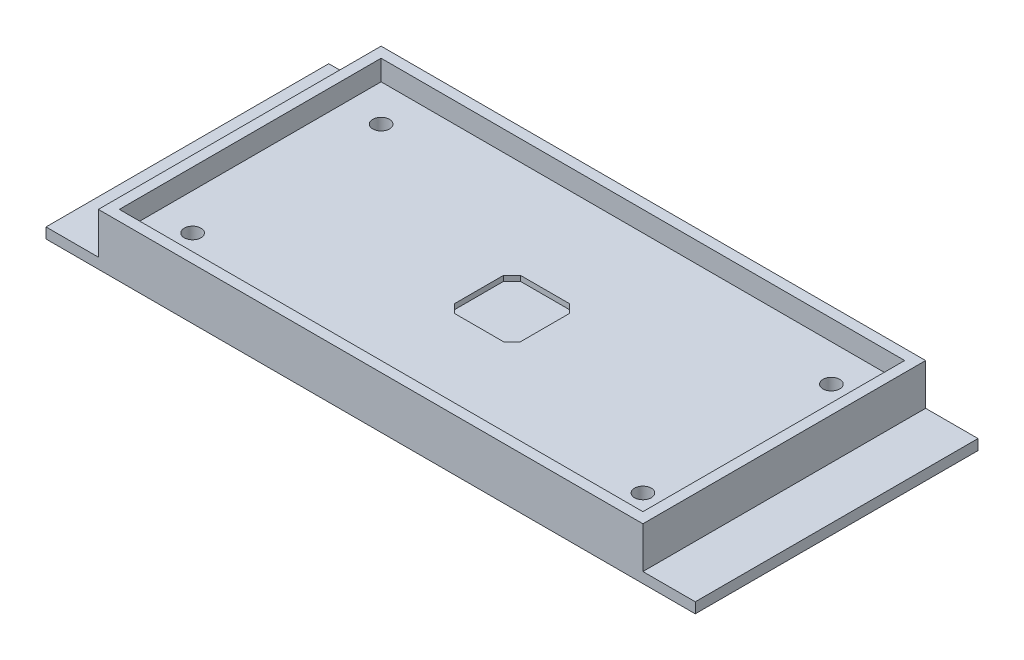
ISO-10303-21;
HEADER;
FILE_DESCRIPTION(('STEP AP214'),'2;1');
FILE_NAME('part.step','',(''),(''),'','','');
FILE_SCHEMA(('AUTOMOTIVE_DESIGN { 1 0 10303 214 1 1 1 1 }'));
ENDSEC;
DATA;
#1=APPLICATION_CONTEXT('core data for automotive mechanical design processes');
#2=APPLICATION_PROTOCOL_DEFINITION('international standard','automotive_design',2000,#1);
#3=PRODUCT_CONTEXT('',#1,'mechanical');
#4=PRODUCT('Part','Part','',(#3));
#5=PRODUCT_RELATED_PRODUCT_CATEGORY('part','',(#4));
#6=PRODUCT_DEFINITION_FORMATION('','',#4);
#7=PRODUCT_DEFINITION_CONTEXT('part definition',#1,'design');
#8=PRODUCT_DEFINITION('design','',#6,#7);
#9=PRODUCT_DEFINITION_SHAPE('','',#8);
#10=(LENGTH_UNIT() NAMED_UNIT(*) SI_UNIT(.MILLI.,.METRE.));
#11=(NAMED_UNIT(*) PLANE_ANGLE_UNIT() SI_UNIT($,.RADIAN.));
#12=(NAMED_UNIT(*) SI_UNIT($,.STERADIAN.) SOLID_ANGLE_UNIT());
#13=UNCERTAINTY_MEASURE_WITH_UNIT(LENGTH_MEASURE(1.E-05),#10,'distance_accuracy_value','');
#14=(GEOMETRIC_REPRESENTATION_CONTEXT(3) GLOBAL_UNCERTAINTY_ASSIGNED_CONTEXT((#13)) GLOBAL_UNIT_ASSIGNED_CONTEXT((#10,
#11,#12)) REPRESENTATION_CONTEXT('',''));
#15=CARTESIAN_POINT('',(0.,0.,0.));
#16=DIRECTION('',(0.,0.,1.));
#17=DIRECTION('',(1.,0.,0.));
#18=AXIS2_PLACEMENT_3D('',#15,#16,#17);
#19=CARTESIAN_POINT('',(31.,1.,0.));
#20=DIRECTION('',(1.,0.,0.));
#21=DIRECTION('',(0.,0.,-1.));
#22=AXIS2_PLACEMENT_3D('',#19,#20,#21);
#23=PLANE('',#22);
#24=DIRECTION('',(0.,0.,1.));
#25=VECTOR('',#24,1.);
#26=CARTESIAN_POINT('',(31.,0.,0.));
#27=LINE('',#26,#25);
#28=CARTESIAN_POINT('',(31.,0.,-13.5));
#29=VERTEX_POINT('',#28);
#30=CARTESIAN_POINT('',(31.,0.,13.5));
#31=VERTEX_POINT('',#30);
#32=EDGE_CURVE('E360',#29,#31,#27,.T.);
#33=ORIENTED_EDGE('',*,*,#32,.F.);
#34=DIRECTION('',(0.,-1.,0.));
#35=VECTOR('',#34,1.);
#36=CARTESIAN_POINT('',(31.,1.,-13.5));
#37=LINE('',#36,#35);
#38=CARTESIAN_POINT('',(31.,1.,-13.5));
#39=VERTEX_POINT('',#38);
#40=EDGE_CURVE('E11',#39,#29,#37,.T.);
#41=ORIENTED_EDGE('',*,*,#40,.F.);
#42=DIRECTION('',(0.,0.,1.));
#43=VECTOR('',#42,1.);
#44=CARTESIAN_POINT('',(31.,1.,0.));
#45=LINE('',#44,#43);
#46=CARTESIAN_POINT('',(31.,1.,13.5));
#47=VERTEX_POINT('',#46);
#48=EDGE_CURVE('E361',#39,#47,#45,.T.);
#49=ORIENTED_EDGE('',*,*,#48,.T.);
#50=DIRECTION('',(0.,-1.,0.));
#51=VECTOR('',#50,1.);
#52=CARTESIAN_POINT('',(31.,1.,13.5));
#53=LINE('',#52,#51);
#54=EDGE_CURVE('E313',#47,#31,#53,.T.);
#55=ORIENTED_EDGE('',*,*,#54,.T.);
#56=EDGE_LOOP('',(#33,#41,#49,#55));
#57=FACE_BOUND('',#56,.T.);
#58=ADVANCED_FACE('F53',(#57),#23,.T.);
#59=CARTESIAN_POINT('',(0.,1.,-13.5));
#60=DIRECTION('',(0.,0.,-1.));
#61=DIRECTION('',(-1.,0.,0.));
#62=AXIS2_PLACEMENT_3D('',#59,#60,#61);
#63=PLANE('',#62);
#64=DIRECTION('',(1.,0.,0.));
#65=VECTOR('',#64,1.);
#66=CARTESIAN_POINT('',(0.,0.,-13.5));
#67=LINE('',#66,#65);
#68=CARTESIAN_POINT('',(-31.,0.,-13.5));
#69=VERTEX_POINT('',#68);
#70=EDGE_CURVE('E364',#69,#29,#67,.T.);
#71=ORIENTED_EDGE('',*,*,#70,.F.);
#72=DIRECTION('',(0.,-1.,0.));
#73=VECTOR('',#72,1.);
#74=CARTESIAN_POINT('',(-31.,1.,-13.5));
#75=LINE('',#74,#73);
#76=CARTESIAN_POINT('',(-31.,1.,-13.5));
#77=VERTEX_POINT('',#76);
#78=EDGE_CURVE('E270',#77,#69,#75,.T.);
#79=ORIENTED_EDGE('',*,*,#78,.F.);
#80=DIRECTION('',(-1.,0.,0.));
#81=VECTOR('',#80,1.);
#82=CARTESIAN_POINT('',(0.,1.,-13.5));
#83=LINE('',#82,#81);
#84=CARTESIAN_POINT('',(-26.,1.,-13.5));
#85=VERTEX_POINT('',#84);
#86=EDGE_CURVE('E266',#85,#77,#83,.T.);
#87=ORIENTED_EDGE('',*,*,#86,.F.);
#88=DIRECTION('',(0.,-1.,0.));
#89=VECTOR('',#88,1.);
#90=CARTESIAN_POINT('',(-26.,4.951,-13.5));
#91=LINE('',#90,#89);
#92=CARTESIAN_POINT('',(-26.,4.951,-13.5));
#93=VERTEX_POINT('',#92);
#94=EDGE_CURVE('E260',#93,#85,#91,.T.);
#95=ORIENTED_EDGE('',*,*,#94,.F.);
#96=DIRECTION('',(1.,0.,0.));
#97=VECTOR('',#96,1.);
#98=CARTESIAN_POINT('',(0.,4.951,-13.5));
#99=LINE('',#98,#97);
#100=CARTESIAN_POINT('',(26.,4.951,-13.5));
#101=VERTEX_POINT('',#100);
#102=EDGE_CURVE('E354',#93,#101,#99,.T.);
#103=ORIENTED_EDGE('',*,*,#102,.T.);
#104=DIRECTION('',(0.,-1.,0.));
#105=VECTOR('',#104,1.);
#106=CARTESIAN_POINT('',(26.,4.951,-13.5));
#107=LINE('',#106,#105);
#108=CARTESIAN_POINT('',(26.,1.,-13.5));
#109=VERTEX_POINT('',#108);
#110=EDGE_CURVE('E357',#101,#109,#107,.T.);
#111=ORIENTED_EDGE('',*,*,#110,.T.);
#112=DIRECTION('',(1.,0.,0.));
#113=VECTOR('',#112,1.);
#114=CARTESIAN_POINT('',(0.,1.,-13.5));
#115=LINE('',#114,#113);
#116=EDGE_CURVE('E363',#109,#39,#115,.T.);
#117=ORIENTED_EDGE('',*,*,#116,.T.);
#118=ORIENTED_EDGE('',*,*,#40,.T.);
#119=EDGE_LOOP('',(#71,#79,#87,#95,#103,#111,#117,#118));
#120=FACE_BOUND('',#119,.T.);
#121=ADVANCED_FACE('F375',(#120),#63,.T.);
#122=CARTESIAN_POINT('',(0.,1.,0.));
#123=DIRECTION('',(0.,1.,0.));
#124=DIRECTION('',(0.,0.,1.));
#125=AXIS2_PLACEMENT_3D('',#122,#123,#124);
#126=PLANE('',#125);
#127=ORIENTED_EDGE('',*,*,#48,.F.);
#128=ORIENTED_EDGE('',*,*,#116,.F.);
#129=DIRECTION('',(0.,0.,1.));
#130=VECTOR('',#129,1.);
#131=CARTESIAN_POINT('',(26.,1.,0.));
#132=LINE('',#131,#130);
#133=CARTESIAN_POINT('',(26.,1.,13.5));
#134=VERTEX_POINT('',#133);
#135=EDGE_CURVE('E60',#109,#134,#132,.T.);
#136=ORIENTED_EDGE('',*,*,#135,.T.);
#137=DIRECTION('',(1.,0.,0.));
#138=VECTOR('',#137,1.);
#139=CARTESIAN_POINT('',(0.,1.,13.5));
#140=LINE('',#139,#138);
#141=EDGE_CURVE('E310',#134,#47,#140,.T.);
#142=ORIENTED_EDGE('',*,*,#141,.T.);
#143=EDGE_LOOP('',(#127,#128,#136,#142));
#144=FACE_BOUND('',#143,.T.);
#145=ADVANCED_FACE('F401',(#144),#126,.T.);
#146=CARTESIAN_POINT('',(0.,0.,0.));
#147=DIRECTION('',(0.,1.,0.));
#148=DIRECTION('',(0.,0.,1.));
#149=AXIS2_PLACEMENT_3D('',#146,#147,#148);
#150=PLANE('',#149);
#151=ORIENTED_EDGE('',*,*,#32,.T.);
#152=DIRECTION('',(1.,0.,0.));
#153=VECTOR('',#152,1.);
#154=CARTESIAN_POINT('',(0.,0.,13.5));
#155=LINE('',#154,#153);
#156=CARTESIAN_POINT('',(-31.,0.,13.5));
#157=VERTEX_POINT('',#156);
#158=EDGE_CURVE('E309',#157,#31,#155,.T.);
#159=ORIENTED_EDGE('',*,*,#158,.F.);
#160=DIRECTION('',(0.,0.,1.));
#161=VECTOR('',#160,1.);
#162=CARTESIAN_POINT('',(-31.,0.,0.));
#163=LINE('',#162,#161);
#164=EDGE_CURVE('E263',#69,#157,#163,.T.);
#165=ORIENTED_EDGE('',*,*,#164,.F.);
#166=ORIENTED_EDGE('',*,*,#70,.T.);
#167=EDGE_LOOP('',(#151,#159,#165,#166));
#168=FACE_BOUND('',#167,.T.);
#169=CARTESIAN_POINT('',(21.5,0.,-9.));
#170=DIRECTION('',(0.,1.,0.));
#171=DIRECTION('',(0.,0.,1.));
#172=AXIS2_PLACEMENT_3D('',#169,#170,#171);
#173=CIRCLE('',#172,0.799999999999999);
#174=CARTESIAN_POINT('',(21.5,0.,-8.2));
#175=VERTEX_POINT('',#174);
#176=EDGE_CURVE('E321',#175,#175,#173,.T.);
#177=ORIENTED_EDGE('',*,*,#176,.T.);
#178=EDGE_LOOP('',(#177));
#179=FACE_BOUND('',#178,.T.);
#180=CARTESIAN_POINT('',(21.5,0.,9.));
#181=DIRECTION('',(0.,-1.,0.));
#182=DIRECTION('',(0.,0.,-1.));
#183=AXIS2_PLACEMENT_3D('',#180,#181,#182);
#184=CIRCLE('',#183,0.799999999999999);
#185=CARTESIAN_POINT('',(21.5,0.,8.2));
#186=VERTEX_POINT('',#185);
#187=EDGE_CURVE('E278',#186,#186,#184,.T.);
#188=ORIENTED_EDGE('',*,*,#187,.F.);
#189=EDGE_LOOP('',(#188));
#190=FACE_BOUND('',#189,.T.);
#191=CARTESIAN_POINT('',(-21.5,0.,-9.));
#192=DIRECTION('',(0.,-1.,0.));
#193=DIRECTION('',(0.,0.,1.));
#194=AXIS2_PLACEMENT_3D('',#191,#192,#193);
#195=CIRCLE('',#194,0.799999999999999);
#196=CARTESIAN_POINT('',(-21.5,0.,-8.2));
#197=VERTEX_POINT('',#196);
#198=EDGE_CURVE('E236',#197,#197,#195,.T.);
#199=ORIENTED_EDGE('',*,*,#198,.F.);
#200=EDGE_LOOP('',(#199));
#201=FACE_BOUND('',#200,.T.);
#202=CARTESIAN_POINT('',(-21.5,0.,9.));
#203=DIRECTION('',(0.,1.,0.));
#204=DIRECTION('',(0.,0.,-1.));
#205=AXIS2_PLACEMENT_3D('',#202,#203,#204);
#206=CIRCLE('',#205,0.799999999999999);
#207=CARTESIAN_POINT('',(-21.5,0.,8.2));
#208=VERTEX_POINT('',#207);
#209=EDGE_CURVE('E217',#208,#208,#206,.T.);
#210=ORIENTED_EDGE('',*,*,#209,.T.);
#211=EDGE_LOOP('',(#210));
#212=FACE_BOUND('',#211,.T.);
#213=ADVANCED_FACE('F371',(#168,#179,#190,#201,#212),#150,.F.);
#214=CARTESIAN_POINT('',(26.,4.951,0.));
#215=DIRECTION('',(1.,0.,0.));
#216=DIRECTION('',(0.,0.,-1.));
#217=AXIS2_PLACEMENT_3D('',#214,#215,#216);
#218=PLANE('',#217);
#219=ORIENTED_EDGE('',*,*,#135,.F.);
#220=ORIENTED_EDGE('',*,*,#110,.F.);
#221=DIRECTION('',(0.,0.,1.));
#222=VECTOR('',#221,1.);
#223=CARTESIAN_POINT('',(26.,4.951,0.));
#224=LINE('',#223,#222);
#225=CARTESIAN_POINT('',(26.,4.951,13.5));
#226=VERTEX_POINT('',#225);
#227=EDGE_CURVE('E352',#101,#226,#224,.T.);
#228=ORIENTED_EDGE('',*,*,#227,.T.);
#229=DIRECTION('',(0.,-1.,0.));
#230=VECTOR('',#229,1.);
#231=CARTESIAN_POINT('',(26.,4.951,13.5));
#232=LINE('',#231,#230);
#233=EDGE_CURVE('E306',#226,#134,#232,.T.);
#234=ORIENTED_EDGE('',*,*,#233,.T.);
#235=EDGE_LOOP('',(#219,#220,#228,#234));
#236=FACE_BOUND('',#235,.T.);
#237=ADVANCED_FACE('F398',(#236),#218,.T.);
#238=CARTESIAN_POINT('',(0.,4.951,0.));
#239=DIRECTION('',(0.,1.,0.));
#240=DIRECTION('',(0.,0.,1.));
#241=AXIS2_PLACEMENT_3D('',#238,#239,#240);
#242=PLANE('',#241);
#243=DIRECTION('',(1.,0.,0.));
#244=VECTOR('',#243,1.);
#245=CARTESIAN_POINT('',(0.,4.951,13.5));
#246=LINE('',#245,#244);
#247=CARTESIAN_POINT('',(-26.,4.951,13.5));
#248=VERTEX_POINT('',#247);
#249=EDGE_CURVE('E303',#248,#226,#246,.T.);
#250=ORIENTED_EDGE('',*,*,#249,.T.);
#251=ORIENTED_EDGE('',*,*,#227,.F.);
#252=ORIENTED_EDGE('',*,*,#102,.F.);
#253=DIRECTION('',(0.,0.,1.));
#254=VECTOR('',#253,1.);
#255=CARTESIAN_POINT('',(-26.,4.951,0.));
#256=LINE('',#255,#254);
#257=EDGE_CURVE('E257',#93,#248,#256,.T.);
#258=ORIENTED_EDGE('',*,*,#257,.T.);
#259=EDGE_LOOP('',(#250,#251,#252,#258));
#260=FACE_BOUND('',#259,.T.);
#261=DIRECTION('',(-1.,0.,0.));
#262=VECTOR('',#261,1.);
#263=CARTESIAN_POINT('',(0.,4.951,-12.5));
#264=LINE('',#263,#262);
#265=CARTESIAN_POINT('',(25.,4.951,-12.5));
#266=VERTEX_POINT('',#265);
#267=CARTESIAN_POINT('',(-25.,4.951,-12.5));
#268=VERTEX_POINT('',#267);
#269=EDGE_CURVE('E346',#266,#268,#264,.T.);
#270=ORIENTED_EDGE('',*,*,#269,.F.);
#271=DIRECTION('',(0.,0.,1.));
#272=VECTOR('',#271,1.);
#273=CARTESIAN_POINT('',(25.,4.951,0.));
#274=LINE('',#273,#272);
#275=CARTESIAN_POINT('',(25.,4.951,12.5));
#276=VERTEX_POINT('',#275);
#277=EDGE_CURVE('E342',#266,#276,#274,.T.);
#278=ORIENTED_EDGE('',*,*,#277,.T.);
#279=DIRECTION('',(-1.,0.,0.));
#280=VECTOR('',#279,1.);
#281=CARTESIAN_POINT('',(0.,4.951,12.5));
#282=LINE('',#281,#280);
#283=CARTESIAN_POINT('',(-25.,4.951,12.5));
#284=VERTEX_POINT('',#283);
#285=EDGE_CURVE('E296',#276,#284,#282,.T.);
#286=ORIENTED_EDGE('',*,*,#285,.T.);
#287=DIRECTION('',(0.,0.,1.));
#288=VECTOR('',#287,1.);
#289=CARTESIAN_POINT('',(-25.,4.951,0.));
#290=LINE('',#289,#288);
#291=EDGE_CURVE('E248',#268,#284,#290,.T.);
#292=ORIENTED_EDGE('',*,*,#291,.F.);
#293=EDGE_LOOP('',(#270,#278,#286,#292));
#294=FACE_BOUND('',#293,.T.);
#295=ADVANCED_FACE('F395',(#260,#294),#242,.T.);
#296=CARTESIAN_POINT('',(0.,3.,-12.5));
#297=DIRECTION('',(0.,0.,-1.));
#298=DIRECTION('',(-1.,0.,0.));
#299=AXIS2_PLACEMENT_3D('',#296,#297,#298);
#300=PLANE('',#299);
#301=ORIENTED_EDGE('',*,*,#269,.T.);
#302=DIRECTION('',(0.,1.,0.));
#303=VECTOR('',#302,1.);
#304=CARTESIAN_POINT('',(-25.,3.,-12.5));
#305=LINE('',#304,#303);
#306=CARTESIAN_POINT('',(-25.,3.,-12.5));
#307=VERTEX_POINT('',#306);
#308=EDGE_CURVE('E252',#307,#268,#305,.T.);
#309=ORIENTED_EDGE('',*,*,#308,.F.);
#310=DIRECTION('',(-1.,0.,0.));
#311=VECTOR('',#310,1.);
#312=CARTESIAN_POINT('',(0.,3.,-12.5));
#313=LINE('',#312,#311);
#314=CARTESIAN_POINT('',(25.,3.,-12.5));
#315=VERTEX_POINT('',#314);
#316=EDGE_CURVE('E345',#315,#307,#313,.T.);
#317=ORIENTED_EDGE('',*,*,#316,.F.);
#318=DIRECTION('',(0.,1.,0.));
#319=VECTOR('',#318,1.);
#320=CARTESIAN_POINT('',(25.,3.,-12.5));
#321=LINE('',#320,#319);
#322=EDGE_CURVE('E348',#315,#266,#321,.T.);
#323=ORIENTED_EDGE('',*,*,#322,.T.);
#324=EDGE_LOOP('',(#301,#309,#317,#323));
#325=FACE_BOUND('',#324,.T.);
#326=ADVANCED_FACE('F419',(#325),#300,.F.);
#327=CARTESIAN_POINT('',(25.,3.,0.));
#328=DIRECTION('',(-1.,0.,0.));
#329=DIRECTION('',(0.,0.,1.));
#330=AXIS2_PLACEMENT_3D('',#327,#328,#329);
#331=PLANE('',#330);
#332=ORIENTED_EDGE('',*,*,#277,.F.);
#333=ORIENTED_EDGE('',*,*,#322,.F.);
#334=DIRECTION('',(0.,0.,1.));
#335=VECTOR('',#334,1.);
#336=CARTESIAN_POINT('',(25.,3.,0.));
#337=LINE('',#336,#335);
#338=CARTESIAN_POINT('',(25.,3.,12.5));
#339=VERTEX_POINT('',#338);
#340=EDGE_CURVE('E343',#315,#339,#337,.T.);
#341=ORIENTED_EDGE('',*,*,#340,.T.);
#342=DIRECTION('',(0.,1.,0.));
#343=VECTOR('',#342,1.);
#344=CARTESIAN_POINT('',(25.,3.,12.5));
#345=LINE('',#344,#343);
#346=EDGE_CURVE('E299',#339,#276,#345,.T.);
#347=ORIENTED_EDGE('',*,*,#346,.T.);
#348=EDGE_LOOP('',(#332,#333,#341,#347));
#349=FACE_BOUND('',#348,.T.);
#350=ADVANCED_FACE('F420',(#349),#331,.T.);
#351=CARTESIAN_POINT('',(0.,3.,0.));
#352=DIRECTION('',(0.,-1.,0.));
#353=DIRECTION('',(0.,0.,-1.));
#354=AXIS2_PLACEMENT_3D('',#351,#352,#353);
#355=PLANE('',#354);
#356=DIRECTION('',(0.,0.,-1.));
#357=VECTOR('',#356,1.);
#358=CARTESIAN_POINT('',(3.15,3.,0.));
#359=LINE('',#358,#357);
#360=CARTESIAN_POINT('',(3.15,3.,2.35));
#361=VERTEX_POINT('',#360);
#362=CARTESIAN_POINT('',(3.15,3.,-2.35));
#363=VERTEX_POINT('',#362);
#364=EDGE_CURVE('E334',#361,#363,#359,.T.);
#365=ORIENTED_EDGE('',*,*,#364,.F.);
#366=DIRECTION('',(0.707106781186548,0.,-0.707106781186547));
#367=VECTOR('',#366,1.);
#368=CARTESIAN_POINT('',(2.75,3.,2.75));
#369=LINE('',#368,#367);
#370=CARTESIAN_POINT('',(2.35,3.,3.15));
#371=VERTEX_POINT('',#370);
#372=EDGE_CURVE('E281',#371,#361,#369,.T.);
#373=ORIENTED_EDGE('',*,*,#372,.F.);
#374=DIRECTION('',(1.,0.,0.));
#375=VECTOR('',#374,1.);
#376=CARTESIAN_POINT('',(0.,3.,3.15));
#377=LINE('',#376,#375);
#378=CARTESIAN_POINT('',(-2.35,3.,3.15));
#379=VERTEX_POINT('',#378);
#380=EDGE_CURVE('E285',#379,#371,#377,.T.);
#381=ORIENTED_EDGE('',*,*,#380,.F.);
#382=DIRECTION('',(-0.707106781186548,0.,-0.707106781186547));
#383=VECTOR('',#382,1.);
#384=CARTESIAN_POINT('',(-2.75,3.,2.75));
#385=LINE('',#384,#383);
#386=CARTESIAN_POINT('',(-3.15,3.,2.35));
#387=VERTEX_POINT('',#386);
#388=EDGE_CURVE('E214',#379,#387,#385,.T.);
#389=ORIENTED_EDGE('',*,*,#388,.T.);
#390=DIRECTION('',(0.,0.,-1.));
#391=VECTOR('',#390,1.);
#392=CARTESIAN_POINT('',(-3.15,3.,0.));
#393=LINE('',#392,#391);
#394=CARTESIAN_POINT('',(-3.15,3.,-2.35));
#395=VERTEX_POINT('',#394);
#396=EDGE_CURVE('E205',#387,#395,#393,.T.);
#397=ORIENTED_EDGE('',*,*,#396,.T.);
#398=DIRECTION('',(-0.707106781186548,0.,0.707106781186547));
#399=VECTOR('',#398,1.);
#400=CARTESIAN_POINT('',(-2.75,3.,-2.75));
#401=LINE('',#400,#399);
#402=CARTESIAN_POINT('',(-2.35,3.,-3.15));
#403=VERTEX_POINT('',#402);
#404=EDGE_CURVE('E239',#403,#395,#401,.T.);
#405=ORIENTED_EDGE('',*,*,#404,.F.);
#406=DIRECTION('',(1.,0.,0.));
#407=VECTOR('',#406,1.);
#408=CARTESIAN_POINT('',(0.,3.,-3.15));
#409=LINE('',#408,#407);
#410=CARTESIAN_POINT('',(2.35,3.,-3.15));
#411=VERTEX_POINT('',#410);
#412=EDGE_CURVE('E327',#403,#411,#409,.T.);
#413=ORIENTED_EDGE('',*,*,#412,.T.);
#414=DIRECTION('',(0.707106781186548,0.,0.707106781186547));
#415=VECTOR('',#414,1.);
#416=CARTESIAN_POINT('',(2.75,3.,-2.75));
#417=LINE('',#416,#415);
#418=EDGE_CURVE('E67',#411,#363,#417,.T.);
#419=ORIENTED_EDGE('',*,*,#418,.T.);
#420=EDGE_LOOP('',(#365,#373,#381,#389,#397,#405,#413,#419));
#421=FACE_BOUND('',#420,.T.);
#422=CARTESIAN_POINT('',(21.5,3.,-9.));
#423=DIRECTION('',(0.,1.,0.));
#424=DIRECTION('',(0.,0.,1.));
#425=AXIS2_PLACEMENT_3D('',#422,#423,#424);
#426=CIRCLE('',#425,0.799999999999988);
#427=CARTESIAN_POINT('',(21.5,3.,-8.20000000000001));
#428=VERTEX_POINT('',#427);
#429=EDGE_CURVE('E318',#428,#428,#426,.T.);
#430=ORIENTED_EDGE('',*,*,#429,.F.);
#431=EDGE_LOOP('',(#430));
#432=FACE_BOUND('',#431,.T.);
#433=DIRECTION('',(-1.,0.,0.));
#434=VECTOR('',#433,1.);
#435=CARTESIAN_POINT('',(0.,3.,12.5));
#436=LINE('',#435,#434);
#437=CARTESIAN_POINT('',(-25.,3.,12.5));
#438=VERTEX_POINT('',#437);
#439=EDGE_CURVE('E297',#339,#438,#436,.T.);
#440=ORIENTED_EDGE('',*,*,#439,.F.);
#441=ORIENTED_EDGE('',*,*,#340,.F.);
#442=ORIENTED_EDGE('',*,*,#316,.T.);
#443=DIRECTION('',(0.,0.,1.));
#444=VECTOR('',#443,1.);
#445=CARTESIAN_POINT('',(-25.,3.,0.));
#446=LINE('',#445,#444);
#447=EDGE_CURVE('E249',#307,#438,#446,.T.);
#448=ORIENTED_EDGE('',*,*,#447,.T.);
#449=EDGE_LOOP('',(#440,#441,#442,#448));
#450=FACE_BOUND('',#449,.T.);
#451=CARTESIAN_POINT('',(21.5,3.,9.));
#452=DIRECTION('',(0.,-1.,0.));
#453=DIRECTION('',(0.,0.,-1.));
#454=AXIS2_PLACEMENT_3D('',#451,#452,#453);
#455=CIRCLE('',#454,0.799999999999988);
#456=CARTESIAN_POINT('',(21.5,3.,8.20000000000001));
#457=VERTEX_POINT('',#456);
#458=EDGE_CURVE('E275',#457,#457,#455,.T.);
#459=ORIENTED_EDGE('',*,*,#458,.T.);
#460=EDGE_LOOP('',(#459));
#461=FACE_BOUND('',#460,.T.);
#462=CARTESIAN_POINT('',(-21.5,3.,-9.));
#463=DIRECTION('',(0.,-1.,0.));
#464=DIRECTION('',(0.,0.,1.));
#465=AXIS2_PLACEMENT_3D('',#462,#463,#464);
#466=CIRCLE('',#465,0.799999999999988);
#467=CARTESIAN_POINT('',(-21.5,3.,-8.20000000000001));
#468=VERTEX_POINT('',#467);
#469=EDGE_CURVE('E233',#468,#468,#466,.T.);
#470=ORIENTED_EDGE('',*,*,#469,.T.);
#471=EDGE_LOOP('',(#470));
#472=FACE_BOUND('',#471,.T.);
#473=CARTESIAN_POINT('',(-21.5,3.,9.));
#474=DIRECTION('',(0.,1.,0.));
#475=DIRECTION('',(0.,0.,-1.));
#476=AXIS2_PLACEMENT_3D('',#473,#474,#475);
#477=CIRCLE('',#476,0.799999999999988);
#478=CARTESIAN_POINT('',(-21.5,3.,8.20000000000001));
#479=VERTEX_POINT('',#478);
#480=EDGE_CURVE('E498',#479,#479,#477,.T.);
#481=ORIENTED_EDGE('',*,*,#480,.F.);
#482=EDGE_LOOP('',(#481));
#483=FACE_BOUND('',#482,.T.);
#484=ADVANCED_FACE('F423',(#421,#432,#450,#461,#472,#483),#355,.F.);
#485=CARTESIAN_POINT('',(2.75,2.5,-2.75));
#486=DIRECTION('',(-0.707106781186547,0.,0.707106781186548));
#487=DIRECTION('',(0.707106781186548,0.,0.707106781186547));
#488=AXIS2_PLACEMENT_3D('',#485,#486,#487);
#489=PLANE('',#488);
#490=ORIENTED_EDGE('',*,*,#418,.F.);
#491=DIRECTION('',(0.,1.,0.));
#492=VECTOR('',#491,1.);
#493=CARTESIAN_POINT('',(2.35,2.5,-3.15));
#494=LINE('',#493,#492);
#495=CARTESIAN_POINT('',(2.35,2.5,-3.15));
#496=VERTEX_POINT('',#495);
#497=EDGE_CURVE('E332',#496,#411,#494,.T.);
#498=ORIENTED_EDGE('',*,*,#497,.F.);
#499=DIRECTION('',(0.707106781186548,0.,0.707106781186547));
#500=VECTOR('',#499,1.);
#501=CARTESIAN_POINT('',(2.75,2.5,-2.75));
#502=LINE('',#501,#500);
#503=CARTESIAN_POINT('',(3.15,2.5,-2.35));
#504=VERTEX_POINT('',#503);
#505=EDGE_CURVE('E324',#496,#504,#502,.T.);
#506=ORIENTED_EDGE('',*,*,#505,.T.);
#507=DIRECTION('',(0.,1.,0.));
#508=VECTOR('',#507,1.);
#509=CARTESIAN_POINT('',(3.15,2.5,-2.35));
#510=LINE('',#509,#508);
#511=EDGE_CURVE('E340',#504,#363,#510,.T.);
#512=ORIENTED_EDGE('',*,*,#511,.T.);
#513=EDGE_LOOP('',(#490,#498,#506,#512));
#514=FACE_BOUND('',#513,.T.);
#515=ADVANCED_FACE('F430',(#514),#489,.T.);
#516=CARTESIAN_POINT('',(3.15,2.5,0.));
#517=DIRECTION('',(1.,0.,0.));
#518=DIRECTION('',(0.,0.,-1.));
#519=AXIS2_PLACEMENT_3D('',#516,#517,#518);
#520=PLANE('',#519);
#521=ORIENTED_EDGE('',*,*,#364,.T.);
#522=ORIENTED_EDGE('',*,*,#511,.F.);
#523=DIRECTION('',(0.,0.,-1.));
#524=VECTOR('',#523,1.);
#525=CARTESIAN_POINT('',(3.15,2.5,0.));
#526=LINE('',#525,#524);
#527=CARTESIAN_POINT('',(3.15,2.5,2.35));
#528=VERTEX_POINT('',#527);
#529=EDGE_CURVE('E326',#528,#504,#526,.T.);
#530=ORIENTED_EDGE('',*,*,#529,.F.);
#531=DIRECTION('',(0.,1.,0.));
#532=VECTOR('',#531,1.);
#533=CARTESIAN_POINT('',(3.15,2.5,2.35));
#534=LINE('',#533,#532);
#535=EDGE_CURVE('E293',#528,#361,#534,.T.);
#536=ORIENTED_EDGE('',*,*,#535,.T.);
#537=EDGE_LOOP('',(#521,#522,#530,#536));
#538=FACE_BOUND('',#537,.T.);
#539=ADVANCED_FACE('F434',(#538),#520,.F.);
#540=CARTESIAN_POINT('',(0.,2.5,-3.15));
#541=DIRECTION('',(0.,0.,1.));
#542=DIRECTION('',(1.,0.,0.));
#543=AXIS2_PLACEMENT_3D('',#540,#541,#542);
#544=PLANE('',#543);
#545=ORIENTED_EDGE('',*,*,#412,.F.);
#546=DIRECTION('',(0.,1.,0.));
#547=VECTOR('',#546,1.);
#548=CARTESIAN_POINT('',(-2.35,2.5,-3.15));
#549=LINE('',#548,#547);
#550=CARTESIAN_POINT('',(-2.35,2.5,-3.15));
#551=VERTEX_POINT('',#550);
#552=EDGE_CURVE('E199',#551,#403,#549,.T.);
#553=ORIENTED_EDGE('',*,*,#552,.F.);
#554=DIRECTION('',(1.,0.,0.));
#555=VECTOR('',#554,1.);
#556=CARTESIAN_POINT('',(0.,2.5,-3.15));
#557=LINE('',#556,#555);
#558=EDGE_CURVE('E330',#551,#496,#557,.T.);
#559=ORIENTED_EDGE('',*,*,#558,.T.);
#560=ORIENTED_EDGE('',*,*,#497,.T.);
#561=EDGE_LOOP('',(#545,#553,#559,#560));
#562=FACE_BOUND('',#561,.T.);
#563=ADVANCED_FACE('F437',(#562),#544,.T.);
#564=CARTESIAN_POINT('',(0.,2.5,0.));
#565=DIRECTION('',(0.,1.,0.));
#566=DIRECTION('',(0.,0.,1.));
#567=AXIS2_PLACEMENT_3D('',#564,#565,#566);
#568=PLANE('',#567);
#569=DIRECTION('',(0.707106781186548,0.,-0.707106781186547));
#570=VECTOR('',#569,1.);
#571=CARTESIAN_POINT('',(2.75,2.5,2.75));
#572=LINE('',#571,#570);
#573=CARTESIAN_POINT('',(2.35,2.5,3.15));
#574=VERTEX_POINT('',#573);
#575=EDGE_CURVE('E282',#574,#528,#572,.T.);
#576=ORIENTED_EDGE('',*,*,#575,.T.);
#577=ORIENTED_EDGE('',*,*,#529,.T.);
#578=ORIENTED_EDGE('',*,*,#505,.F.);
#579=ORIENTED_EDGE('',*,*,#558,.F.);
#580=DIRECTION('',(-0.707106781186548,0.,0.707106781186547));
#581=VECTOR('',#580,1.);
#582=CARTESIAN_POINT('',(-2.75,2.5,-2.75));
#583=LINE('',#582,#581);
#584=CARTESIAN_POINT('',(-3.15,2.5,-2.35));
#585=VERTEX_POINT('',#584);
#586=EDGE_CURVE('E196',#551,#585,#583,.T.);
#587=ORIENTED_EDGE('',*,*,#586,.T.);
#588=DIRECTION('',(0.,0.,-1.));
#589=VECTOR('',#588,1.);
#590=CARTESIAN_POINT('',(-3.15,2.5,0.));
#591=LINE('',#590,#589);
#592=CARTESIAN_POINT('',(-3.15,2.5,2.35));
#593=VERTEX_POINT('',#592);
#594=EDGE_CURVE('E188',#593,#585,#591,.T.);
#595=ORIENTED_EDGE('',*,*,#594,.F.);
#596=DIRECTION('',(-0.707106781186548,0.,-0.707106781186547));
#597=VECTOR('',#596,1.);
#598=CARTESIAN_POINT('',(-2.75,2.5,2.75));
#599=LINE('',#598,#597);
#600=CARTESIAN_POINT('',(-2.35,2.5,3.15));
#601=VERTEX_POINT('',#600);
#602=EDGE_CURVE('E193',#601,#593,#599,.T.);
#603=ORIENTED_EDGE('',*,*,#602,.F.);
#604=DIRECTION('',(1.,0.,0.));
#605=VECTOR('',#604,1.);
#606=CARTESIAN_POINT('',(0.,2.5,3.15));
#607=LINE('',#606,#605);
#608=EDGE_CURVE('E284',#601,#574,#607,.T.);
#609=ORIENTED_EDGE('',*,*,#608,.T.);
#610=EDGE_LOOP('',(#576,#577,#578,#579,#587,#595,#603,#609));
#611=FACE_BOUND('',#610,.T.);
#612=ADVANCED_FACE('F191',(#611),#568,.T.);
#613=CARTESIAN_POINT('',(21.5,3.,-9.));
#614=DIRECTION('',(0.,1.,0.));
#615=DIRECTION('',(0.,0.,1.));
#616=AXIS2_PLACEMENT_3D('',#613,#614,#615);
#617=CYLINDRICAL_SURFACE('',#616,0.799999999999993);
#618=ORIENTED_EDGE('',*,*,#176,.F.);
#619=EDGE_LOOP('',(#618));
#620=FACE_BOUND('',#619,.T.);
#621=ORIENTED_EDGE('',*,*,#429,.T.);
#622=EDGE_LOOP('',(#621));
#623=FACE_BOUND('',#622,.T.);
#624=ADVANCED_FACE('F444',(#620,#623),#617,.F.);
#625=CARTESIAN_POINT('',(0.,1.,13.5));
#626=DIRECTION('',(0.,0.,1.));
#627=DIRECTION('',(-1.,0.,0.));
#628=AXIS2_PLACEMENT_3D('',#625,#626,#627);
#629=PLANE('',#628);
#630=ORIENTED_EDGE('',*,*,#158,.T.);
#631=ORIENTED_EDGE('',*,*,#54,.F.);
#632=ORIENTED_EDGE('',*,*,#141,.F.);
#633=ORIENTED_EDGE('',*,*,#233,.F.);
#634=ORIENTED_EDGE('',*,*,#249,.F.);
#635=DIRECTION('',(0.,-1.,0.));
#636=VECTOR('',#635,1.);
#637=CARTESIAN_POINT('',(-26.,4.951,13.5));
#638=LINE('',#637,#636);
#639=CARTESIAN_POINT('',(-26.,1.,13.5));
#640=VERTEX_POINT('',#639);
#641=EDGE_CURVE('E224',#248,#640,#638,.T.);
#642=ORIENTED_EDGE('',*,*,#641,.T.);
#643=DIRECTION('',(-1.,0.,0.));
#644=VECTOR('',#643,1.);
#645=CARTESIAN_POINT('',(0.,1.,13.5));
#646=LINE('',#645,#644);
#647=CARTESIAN_POINT('',(-31.,1.,13.5));
#648=VERTEX_POINT('',#647);
#649=EDGE_CURVE('E227',#640,#648,#646,.T.);
#650=ORIENTED_EDGE('',*,*,#649,.T.);
#651=DIRECTION('',(0.,-1.,0.));
#652=VECTOR('',#651,1.);
#653=CARTESIAN_POINT('',(-31.,1.,13.5));
#654=LINE('',#653,#652);
#655=EDGE_CURVE('E230',#648,#157,#654,.T.);
#656=ORIENTED_EDGE('',*,*,#655,.T.);
#657=EDGE_LOOP('',(#630,#631,#632,#633,#634,#642,#650,#656));
#658=FACE_BOUND('',#657,.T.);
#659=ADVANCED_FACE('F385',(#658),#629,.T.);
#660=CARTESIAN_POINT('',(0.,3.,12.5));
#661=DIRECTION('',(0.,0.,1.));
#662=DIRECTION('',(-1.,0.,0.));
#663=AXIS2_PLACEMENT_3D('',#660,#661,#662);
#664=PLANE('',#663);
#665=ORIENTED_EDGE('',*,*,#285,.F.);
#666=ORIENTED_EDGE('',*,*,#346,.F.);
#667=ORIENTED_EDGE('',*,*,#439,.T.);
#668=DIRECTION('',(0.,1.,0.));
#669=VECTOR('',#668,1.);
#670=CARTESIAN_POINT('',(-25.,3.,12.5));
#671=LINE('',#670,#669);
#672=EDGE_CURVE('E209',#438,#284,#671,.T.);
#673=ORIENTED_EDGE('',*,*,#672,.T.);
#674=EDGE_LOOP('',(#665,#666,#667,#673));
#675=FACE_BOUND('',#674,.T.);
#676=ADVANCED_FACE('F450',(#675),#664,.F.);
#677=CARTESIAN_POINT('',(2.75,2.5,2.75));
#678=DIRECTION('',(-0.707106781186547,0.,-0.707106781186548));
#679=DIRECTION('',(0.707106781186548,0.,-0.707106781186547));
#680=AXIS2_PLACEMENT_3D('',#677,#678,#679);
#681=PLANE('',#680);
#682=ORIENTED_EDGE('',*,*,#372,.T.);
#683=ORIENTED_EDGE('',*,*,#535,.F.);
#684=ORIENTED_EDGE('',*,*,#575,.F.);
#685=DIRECTION('',(0.,1.,0.));
#686=VECTOR('',#685,1.);
#687=CARTESIAN_POINT('',(2.35,2.5,3.15));
#688=LINE('',#687,#686);
#689=EDGE_CURVE('E287',#574,#371,#688,.T.);
#690=ORIENTED_EDGE('',*,*,#689,.T.);
#691=EDGE_LOOP('',(#682,#683,#684,#690));
#692=FACE_BOUND('',#691,.T.);
#693=ADVANCED_FACE('F453',(#692),#681,.T.);
#694=CARTESIAN_POINT('',(0.,2.5,3.15));
#695=DIRECTION('',(0.,0.,-1.));
#696=DIRECTION('',(1.,0.,0.));
#697=AXIS2_PLACEMENT_3D('',#694,#695,#696);
#698=PLANE('',#697);
#699=ORIENTED_EDGE('',*,*,#380,.T.);
#700=ORIENTED_EDGE('',*,*,#689,.F.);
#701=ORIENTED_EDGE('',*,*,#608,.F.);
#702=DIRECTION('',(0.,1.,0.));
#703=VECTOR('',#702,1.);
#704=CARTESIAN_POINT('',(-2.35,2.5,3.15));
#705=LINE('',#704,#703);
#706=EDGE_CURVE('E210',#601,#379,#705,.T.);
#707=ORIENTED_EDGE('',*,*,#706,.T.);
#708=EDGE_LOOP('',(#699,#700,#701,#707));
#709=FACE_BOUND('',#708,.T.);
#710=ADVANCED_FACE('F457',(#709),#698,.T.);
#711=CARTESIAN_POINT('',(21.5,3.,9.));
#712=DIRECTION('',(0.,1.,0.));
#713=DIRECTION('',(0.,0.,-1.));
#714=AXIS2_PLACEMENT_3D('',#711,#712,#713);
#715=CYLINDRICAL_SURFACE('',#714,0.799999999999993);
#716=ORIENTED_EDGE('',*,*,#187,.T.);
#717=EDGE_LOOP('',(#716));
#718=FACE_BOUND('',#717,.T.);
#719=ORIENTED_EDGE('',*,*,#458,.F.);
#720=EDGE_LOOP('',(#719));
#721=FACE_BOUND('',#720,.T.);
#722=ADVANCED_FACE('F461',(#718,#721),#715,.F.);
#723=CARTESIAN_POINT('',(-31.,1.,0.));
#724=DIRECTION('',(-1.,0.,0.));
#725=DIRECTION('',(0.,0.,-1.));
#726=AXIS2_PLACEMENT_3D('',#723,#724,#725);
#727=PLANE('',#726);
#728=ORIENTED_EDGE('',*,*,#164,.T.);
#729=ORIENTED_EDGE('',*,*,#655,.F.);
#730=DIRECTION('',(0.,0.,1.));
#731=VECTOR('',#730,1.);
#732=CARTESIAN_POINT('',(-31.,1.,0.));
#733=LINE('',#732,#731);
#734=EDGE_CURVE('E264',#77,#648,#733,.T.);
#735=ORIENTED_EDGE('',*,*,#734,.F.);
#736=ORIENTED_EDGE('',*,*,#78,.T.);
#737=EDGE_LOOP('',(#728,#729,#735,#736));
#738=FACE_BOUND('',#737,.T.);
#739=ADVANCED_FACE('F379',(#738),#727,.T.);
#740=CARTESIAN_POINT('',(0.,1.,0.));
#741=DIRECTION('',(0.,1.,0.));
#742=DIRECTION('',(0.,0.,1.));
#743=AXIS2_PLACEMENT_3D('',#740,#741,#742);
#744=PLANE('',#743);
#745=ORIENTED_EDGE('',*,*,#734,.T.);
#746=ORIENTED_EDGE('',*,*,#649,.F.);
#747=DIRECTION('',(0.,0.,1.));
#748=VECTOR('',#747,1.);
#749=CARTESIAN_POINT('',(-26.,1.,0.));
#750=LINE('',#749,#748);
#751=EDGE_CURVE('E268',#85,#640,#750,.T.);
#752=ORIENTED_EDGE('',*,*,#751,.F.);
#753=ORIENTED_EDGE('',*,*,#86,.T.);
#754=EDGE_LOOP('',(#745,#746,#752,#753));
#755=FACE_BOUND('',#754,.T.);
#756=ADVANCED_FACE('F383',(#755),#744,.T.);
#757=CARTESIAN_POINT('',(-26.,4.951,0.));
#758=DIRECTION('',(-1.,0.,0.));
#759=DIRECTION('',(0.,0.,-1.));
#760=AXIS2_PLACEMENT_3D('',#757,#758,#759);
#761=PLANE('',#760);
#762=ORIENTED_EDGE('',*,*,#751,.T.);
#763=ORIENTED_EDGE('',*,*,#641,.F.);
#764=ORIENTED_EDGE('',*,*,#257,.F.);
#765=ORIENTED_EDGE('',*,*,#94,.T.);
#766=EDGE_LOOP('',(#762,#763,#764,#765));
#767=FACE_BOUND('',#766,.T.);
#768=ADVANCED_FACE('F390',(#767),#761,.T.);
#769=CARTESIAN_POINT('',(-25.,3.,0.));
#770=DIRECTION('',(1.,0.,0.));
#771=DIRECTION('',(0.,0.,1.));
#772=AXIS2_PLACEMENT_3D('',#769,#770,#771);
#773=PLANE('',#772);
#774=ORIENTED_EDGE('',*,*,#291,.T.);
#775=ORIENTED_EDGE('',*,*,#672,.F.);
#776=ORIENTED_EDGE('',*,*,#447,.F.);
#777=ORIENTED_EDGE('',*,*,#308,.T.);
#778=EDGE_LOOP('',(#774,#775,#776,#777));
#779=FACE_BOUND('',#778,.T.);
#780=ADVANCED_FACE('F472',(#779),#773,.T.);
#781=CARTESIAN_POINT('',(-2.75,2.5,-2.75));
#782=DIRECTION('',(0.707106781186547,0.,0.707106781186548));
#783=DIRECTION('',(-0.707106781186548,0.,0.707106781186547));
#784=AXIS2_PLACEMENT_3D('',#781,#782,#783);
#785=PLANE('',#784);
#786=ORIENTED_EDGE('',*,*,#404,.T.);
#787=DIRECTION('',(0.,1.,0.));
#788=VECTOR('',#787,1.);
#789=CARTESIAN_POINT('',(-3.15,2.5,-2.35));
#790=LINE('',#789,#788);
#791=EDGE_CURVE('E246',#585,#395,#790,.T.);
#792=ORIENTED_EDGE('',*,*,#791,.F.);
#793=ORIENTED_EDGE('',*,*,#586,.F.);
#794=ORIENTED_EDGE('',*,*,#552,.T.);
#795=EDGE_LOOP('',(#786,#792,#793,#794));
#796=FACE_BOUND('',#795,.T.);
#797=ADVANCED_FACE('F475',(#796),#785,.T.);
#798=CARTESIAN_POINT('',(-3.15,2.5,0.));
#799=DIRECTION('',(-1.,0.,0.));
#800=DIRECTION('',(0.,0.,-1.));
#801=AXIS2_PLACEMENT_3D('',#798,#799,#800);
#802=PLANE('',#801);
#803=ORIENTED_EDGE('',*,*,#396,.F.);
#804=DIRECTION('',(0.,1.,0.));
#805=VECTOR('',#804,1.);
#806=CARTESIAN_POINT('',(-3.15,2.5,2.35));
#807=LINE('',#806,#805);
#808=EDGE_CURVE('E202',#593,#387,#807,.T.);
#809=ORIENTED_EDGE('',*,*,#808,.F.);
#810=ORIENTED_EDGE('',*,*,#594,.T.);
#811=ORIENTED_EDGE('',*,*,#791,.T.);
#812=EDGE_LOOP('',(#803,#809,#810,#811));
#813=FACE_BOUND('',#812,.T.);
#814=ADVANCED_FACE('F203',(#813),#802,.F.);
#815=CARTESIAN_POINT('',(-21.5,3.,-9.));
#816=DIRECTION('',(0.,1.,0.));
#817=DIRECTION('',(0.,0.,1.));
#818=AXIS2_PLACEMENT_3D('',#815,#816,#817);
#819=CYLINDRICAL_SURFACE('',#818,0.799999999999993);
#820=ORIENTED_EDGE('',*,*,#198,.T.);
#821=EDGE_LOOP('',(#820));
#822=FACE_BOUND('',#821,.T.);
#823=ORIENTED_EDGE('',*,*,#469,.F.);
#824=EDGE_LOOP('',(#823));
#825=FACE_BOUND('',#824,.T.);
#826=ADVANCED_FACE('F482',(#822,#825),#819,.F.);
#827=CARTESIAN_POINT('',(-2.75,2.5,2.75));
#828=DIRECTION('',(0.707106781186547,0.,-0.707106781186548));
#829=DIRECTION('',(-0.707106781186548,0.,-0.707106781186547));
#830=AXIS2_PLACEMENT_3D('',#827,#828,#829);
#831=PLANE('',#830);
#832=ORIENTED_EDGE('',*,*,#388,.F.);
#833=ORIENTED_EDGE('',*,*,#706,.F.);
#834=ORIENTED_EDGE('',*,*,#602,.T.);
#835=ORIENTED_EDGE('',*,*,#808,.T.);
#836=EDGE_LOOP('',(#832,#833,#834,#835));
#837=FACE_BOUND('',#836,.T.);
#838=ADVANCED_FACE('F212',(#837),#831,.T.);
#839=CARTESIAN_POINT('',(-21.5,3.,9.));
#840=DIRECTION('',(0.,1.,0.));
#841=DIRECTION('',(0.,0.,-1.));
#842=AXIS2_PLACEMENT_3D('',#839,#840,#841);
#843=CYLINDRICAL_SURFACE('',#842,0.799999999999993);
#844=ORIENTED_EDGE('',*,*,#209,.F.);
#845=EDGE_LOOP('',(#844));
#846=FACE_BOUND('',#845,.T.);
#847=ORIENTED_EDGE('',*,*,#480,.T.);
#848=EDGE_LOOP('',(#847));
#849=FACE_BOUND('',#848,.T.);
#850=ADVANCED_FACE('F488',(#846,#849),#843,.F.);
#851=CLOSED_SHELL('',(#58,#121,#145,#213,#237,#295,#326,#350,#484,#515,#539,#563,#612,#624,#659,
#676,#693,#710,#722,#739,#756,#768,#780,#797,#814,#826,#838,#850));
#852=MANIFOLD_SOLID_BREP('B2',#851);
#853=ADVANCED_BREP_SHAPE_REPRESENTATION('',(#18,#852),#14);
#854=SHAPE_DEFINITION_REPRESENTATION(#9,#853);
ENDSEC;
END-ISO-10303-21;
